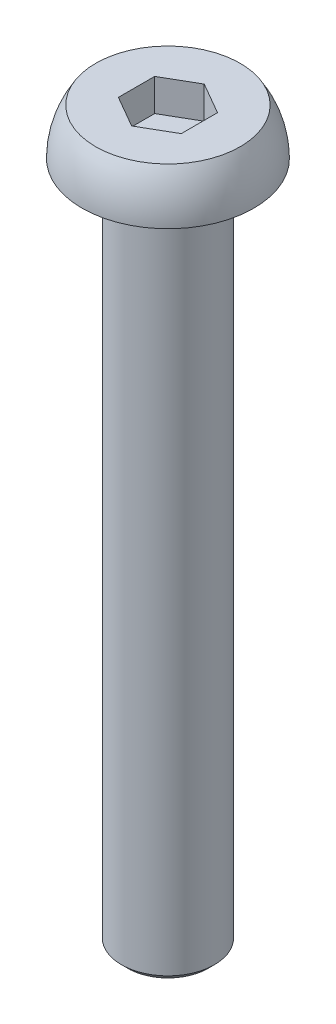
ISO-10303-21;
HEADER;
FILE_DESCRIPTION(('STEP AP214'),'2;1');
FILE_NAME('part.step','',(''),(''),'','','');
FILE_SCHEMA(('AUTOMOTIVE_DESIGN { 1 0 10303 214 1 1 1 1 }'));
ENDSEC;
DATA;
#1=APPLICATION_CONTEXT('core data for automotive mechanical design processes');
#2=APPLICATION_PROTOCOL_DEFINITION('international standard','automotive_design',2000,#1);
#3=PRODUCT_CONTEXT('',#1,'mechanical');
#4=PRODUCT('Part','Part','',(#3));
#5=PRODUCT_RELATED_PRODUCT_CATEGORY('part','',(#4));
#6=PRODUCT_DEFINITION_FORMATION('','',#4);
#7=PRODUCT_DEFINITION_CONTEXT('part definition',#1,'design');
#8=PRODUCT_DEFINITION('design','',#6,#7);
#9=PRODUCT_DEFINITION_SHAPE('','',#8);
#10=(LENGTH_UNIT() NAMED_UNIT(*) SI_UNIT(.MILLI.,.METRE.));
#11=(NAMED_UNIT(*) PLANE_ANGLE_UNIT() SI_UNIT($,.RADIAN.));
#12=(NAMED_UNIT(*) SI_UNIT($,.STERADIAN.) SOLID_ANGLE_UNIT());
#13=UNCERTAINTY_MEASURE_WITH_UNIT(LENGTH_MEASURE(1.E-05),#10,'distance_accuracy_value','');
#14=(GEOMETRIC_REPRESENTATION_CONTEXT(3) GLOBAL_UNCERTAINTY_ASSIGNED_CONTEXT((#13)) GLOBAL_UNIT_ASSIGNED_CONTEXT((#10,
#11,#12)) REPRESENTATION_CONTEXT('',''));
#15=CARTESIAN_POINT('',(0.,0.,0.));
#16=DIRECTION('',(0.,0.,1.));
#17=DIRECTION('',(1.,0.,0.));
#18=AXIS2_PLACEMENT_3D('',#15,#16,#17);
#19=CARTESIAN_POINT('',(-2.33465736244101,1.5,0.));
#20=DIRECTION('',(0.,1.,0.));
#21=DIRECTION('',(0.,0.,1.));
#22=AXIS2_PLACEMENT_3D('',#19,#20,#21);
#23=PLANE('',#22);
#24=DIRECTION('',(-0.866025403784439,0.,-0.5));
#25=VECTOR('',#24,1.);
#26=CARTESIAN_POINT('',(1.015,1.5,-0.58601052322747));
#27=LINE('',#26,#25);
#28=CARTESIAN_POINT('',(1.015,1.5,-0.58601052322747));
#29=VERTEX_POINT('',#28);
#30=CARTESIAN_POINT('',(0.,1.5,-1.17202104645494));
#31=VERTEX_POINT('',#30);
#32=EDGE_CURVE('E58',#29,#31,#27,.T.);
#33=ORIENTED_EDGE('',*,*,#32,.F.);
#34=DIRECTION('',(0.,0.,-1.));
#35=VECTOR('',#34,1.);
#36=CARTESIAN_POINT('',(1.015,1.5,0.58601052322747));
#37=LINE('',#36,#35);
#38=CARTESIAN_POINT('',(1.015,1.5,0.58601052322747));
#39=VERTEX_POINT('',#38);
#40=EDGE_CURVE('E151',#39,#29,#37,.T.);
#41=ORIENTED_EDGE('',*,*,#40,.F.);
#42=DIRECTION('',(0.866025403784439,0.,-0.5));
#43=VECTOR('',#42,1.);
#44=CARTESIAN_POINT('',(0.,1.5,1.17202104645494));
#45=LINE('',#44,#43);
#46=CARTESIAN_POINT('',(0.,1.5,1.17202104645494));
#47=VERTEX_POINT('',#46);
#48=EDGE_CURVE('E148',#47,#39,#45,.T.);
#49=ORIENTED_EDGE('',*,*,#48,.F.);
#50=DIRECTION('',(0.866025403784439,0.,0.5));
#51=VECTOR('',#50,1.);
#52=CARTESIAN_POINT('',(-1.015,1.5,0.58601052322747));
#53=LINE('',#52,#51);
#54=CARTESIAN_POINT('',(-1.015,1.5,0.58601052322747));
#55=VERTEX_POINT('',#54);
#56=EDGE_CURVE('E106',#55,#47,#53,.T.);
#57=ORIENTED_EDGE('',*,*,#56,.F.);
#58=DIRECTION('',(0.,0.,1.));
#59=VECTOR('',#58,1.);
#60=CARTESIAN_POINT('',(-1.015,1.5,-0.58601052322747));
#61=LINE('',#60,#59);
#62=CARTESIAN_POINT('',(-1.015,1.5,-0.58601052322747));
#63=VERTEX_POINT('',#62);
#64=EDGE_CURVE('E142',#63,#55,#61,.T.);
#65=ORIENTED_EDGE('',*,*,#64,.F.);
#66=DIRECTION('',(-0.866025403784439,0.,0.5));
#67=VECTOR('',#66,1.);
#68=CARTESIAN_POINT('',(0.,1.5,-1.17202104645494));
#69=LINE('',#68,#67);
#70=EDGE_CURVE('E138',#31,#63,#69,.T.);
#71=ORIENTED_EDGE('',*,*,#70,.F.);
#72=EDGE_LOOP('',(#33,#41,#49,#57,#65,#71));
#73=FACE_BOUND('',#72,.T.);
#74=CARTESIAN_POINT('',(0.,1.5,0.));
#75=DIRECTION('',(0.,1.,0.));
#76=DIRECTION('',(0.,0.,1.));
#77=AXIS2_PLACEMENT_3D('',#74,#75,#76);
#78=CIRCLE('',#77,2.33465736244101);
#79=CARTESIAN_POINT('',(0.,1.5,2.33465736244101));
#80=VERTEX_POINT('',#79);
#81=EDGE_CURVE('E171',#80,#80,#78,.T.);
#82=ORIENTED_EDGE('',*,*,#81,.T.);
#83=EDGE_LOOP('',(#82));
#84=FACE_BOUND('',#83,.T.);
#85=ADVANCED_FACE('F41',(#73,#84),#23,.T.);
#86=CARTESIAN_POINT('',(0.,0.,0.));
#87=DIRECTION('',(0.,1.,0.));
#88=DIRECTION('',(-1.,0.,0.));
#89=AXIS2_PLACEMENT_3D('',#86,#87,#88);
#90=SPHERICAL_SURFACE('',#89,2.775);
#91=CARTESIAN_POINT('',(0.,0.,0.));
#92=DIRECTION('',(0.,1.,0.));
#93=DIRECTION('',(0.,0.,1.));
#94=AXIS2_PLACEMENT_3D('',#91,#92,#93);
#95=CIRCLE('',#94,2.775);
#96=CARTESIAN_POINT('',(0.,0.,2.775));
#97=VERTEX_POINT('',#96);
#98=EDGE_CURVE('E157',#97,#97,#95,.T.);
#99=ORIENTED_EDGE('',*,*,#98,.T.);
#100=EDGE_LOOP('',(#99));
#101=FACE_BOUND('',#100,.T.);
#102=ORIENTED_EDGE('',*,*,#81,.F.);
#103=EDGE_LOOP('',(#102));
#104=FACE_BOUND('',#103,.T.);
#105=ADVANCED_FACE('F192',(#101,#104),#90,.T.);
#106=CARTESIAN_POINT('',(0.,0.,0.));
#107=DIRECTION('',(0.,-1.,0.));
#108=DIRECTION('',(0.,0.,-1.));
#109=AXIS2_PLACEMENT_3D('',#106,#107,#108);
#110=PLANE('',#109);
#111=CARTESIAN_POINT('',(0.,0.,0.));
#112=DIRECTION('',(0.,-1.,0.));
#113=DIRECTION('',(0.,0.,-1.));
#114=AXIS2_PLACEMENT_3D('',#111,#112,#113);
#115=CIRCLE('',#114,1.5);
#116=CARTESIAN_POINT('',(0.,0.,-1.5));
#117=VERTEX_POINT('',#116);
#118=EDGE_CURVE('E167',#117,#117,#115,.T.);
#119=ORIENTED_EDGE('',*,*,#118,.F.);
#120=EDGE_LOOP('',(#119));
#121=FACE_BOUND('',#120,.T.);
#122=ORIENTED_EDGE('',*,*,#98,.F.);
#123=EDGE_LOOP('',(#122));
#124=FACE_BOUND('',#123,.T.);
#125=ADVANCED_FACE('F197',(#121,#124),#110,.T.);
#126=CARTESIAN_POINT('',(0.,-22.,0.));
#127=DIRECTION('',(0.,1.,0.));
#128=DIRECTION('',(0.,0.,1.));
#129=AXIS2_PLACEMENT_3D('',#126,#127,#128);
#130=CYLINDRICAL_SURFACE('',#129,1.5);
#131=CARTESIAN_POINT('',(0.,-21.8,0.));
#132=DIRECTION('',(0.,-1.,0.));
#133=DIRECTION('',(0.,0.,-1.));
#134=AXIS2_PLACEMENT_3D('',#131,#132,#133);
#135=CIRCLE('',#134,1.5);
#136=CARTESIAN_POINT('',(0.,-21.8,-1.5));
#137=VERTEX_POINT('',#136);
#138=EDGE_CURVE('E11',#137,#137,#135,.F.);
#139=ORIENTED_EDGE('',*,*,#138,.T.);
#140=EDGE_LOOP('',(#139));
#141=FACE_BOUND('',#140,.T.);
#142=ORIENTED_EDGE('',*,*,#118,.T.);
#143=EDGE_LOOP('',(#142));
#144=FACE_BOUND('',#143,.T.);
#145=ADVANCED_FACE('F204',(#141,#144),#130,.T.);
#146=CARTESIAN_POINT('',(0.,-22.,0.));
#147=DIRECTION('',(0.,-1.,0.));
#148=DIRECTION('',(0.,0.,-1.));
#149=AXIS2_PLACEMENT_3D('',#146,#147,#148);
#150=PLANE('',#149);
#151=CARTESIAN_POINT('',(0.,-22.,0.));
#152=DIRECTION('',(0.,-1.,0.));
#153=DIRECTION('',(0.,0.,-1.));
#154=AXIS2_PLACEMENT_3D('',#151,#152,#153);
#155=CIRCLE('',#154,1.3);
#156=CARTESIAN_POINT('',(0.,-22.,-1.3));
#157=VERTEX_POINT('',#156);
#158=EDGE_CURVE('E51',#157,#157,#155,.T.);
#159=ORIENTED_EDGE('',*,*,#158,.T.);
#160=EDGE_LOOP('',(#159));
#161=FACE_BOUND('',#160,.T.);
#162=ADVANCED_FACE('F181',(#161),#150,.T.);
#163=CARTESIAN_POINT('',(1.015,0.459999999999999,-0.58601052322747));
#164=DIRECTION('',(0.5,0.,-0.866025403784439));
#165=DIRECTION('',(-0.866025403784439,0.,-0.5));
#166=AXIS2_PLACEMENT_3D('',#163,#164,#165);
#167=PLANE('',#166);
#168=ORIENTED_EDGE('',*,*,#32,.T.);
#169=DIRECTION('',(0.,1.,0.));
#170=VECTOR('',#169,1.);
#171=CARTESIAN_POINT('',(0.,0.459999999999999,-1.17202104645494));
#172=LINE('',#171,#170);
#173=CARTESIAN_POINT('',(0.,0.459999999999999,-1.17202104645494));
#174=VERTEX_POINT('',#173);
#175=EDGE_CURVE('E88',#174,#31,#172,.T.);
#176=ORIENTED_EDGE('',*,*,#175,.F.);
#177=DIRECTION('',(-0.866025403784439,0.,-0.5));
#178=VECTOR('',#177,1.);
#179=CARTESIAN_POINT('',(1.015,0.459999999999999,-0.58601052322747));
#180=LINE('',#179,#178);
#181=CARTESIAN_POINT('',(1.015,0.459999999999999,-0.58601052322747));
#182=VERTEX_POINT('',#181);
#183=EDGE_CURVE('E154',#182,#174,#180,.T.);
#184=ORIENTED_EDGE('',*,*,#183,.F.);
#185=DIRECTION('',(0.,1.,0.));
#186=VECTOR('',#185,1.);
#187=CARTESIAN_POINT('',(1.015,0.459999999999999,-0.58601052322747));
#188=LINE('',#187,#186);
#189=EDGE_CURVE('E66',#182,#29,#188,.T.);
#190=ORIENTED_EDGE('',*,*,#189,.T.);
#191=EDGE_LOOP('',(#168,#176,#184,#190));
#192=FACE_BOUND('',#191,.T.);
#193=ADVANCED_FACE('F211',(#192),#167,.F.);
#194=CARTESIAN_POINT('',(1.015,0.459999999999999,0.58601052322747));
#195=DIRECTION('',(1.,0.,0.));
#196=DIRECTION('',(0.,0.,-1.));
#197=AXIS2_PLACEMENT_3D('',#194,#195,#196);
#198=PLANE('',#197);
#199=ORIENTED_EDGE('',*,*,#40,.T.);
#200=ORIENTED_EDGE('',*,*,#189,.F.);
#201=DIRECTION('',(0.,0.,-1.));
#202=VECTOR('',#201,1.);
#203=CARTESIAN_POINT('',(1.015,0.459999999999999,0.58601052322747));
#204=LINE('',#203,#202);
#205=CARTESIAN_POINT('',(1.015,0.459999999999999,0.58601052322747));
#206=VERTEX_POINT('',#205);
#207=EDGE_CURVE('E120',#206,#182,#204,.T.);
#208=ORIENTED_EDGE('',*,*,#207,.F.);
#209=DIRECTION('',(0.,1.,0.));
#210=VECTOR('',#209,1.);
#211=CARTESIAN_POINT('',(1.015,0.459999999999999,0.58601052322747));
#212=LINE('',#211,#210);
#213=EDGE_CURVE('E111',#206,#39,#212,.T.);
#214=ORIENTED_EDGE('',*,*,#213,.T.);
#215=EDGE_LOOP('',(#199,#200,#208,#214));
#216=FACE_BOUND('',#215,.T.);
#217=ADVANCED_FACE('F214',(#216),#198,.F.);
#218=CARTESIAN_POINT('',(0.,0.459999999999999,1.17202104645494));
#219=DIRECTION('',(0.5,0.,0.866025403784439));
#220=DIRECTION('',(0.866025403784439,0.,-0.5));
#221=AXIS2_PLACEMENT_3D('',#218,#219,#220);
#222=PLANE('',#221);
#223=ORIENTED_EDGE('',*,*,#48,.T.);
#224=ORIENTED_EDGE('',*,*,#213,.F.);
#225=DIRECTION('',(0.866025403784439,0.,-0.5));
#226=VECTOR('',#225,1.);
#227=CARTESIAN_POINT('',(0.,0.459999999999999,1.17202104645494));
#228=LINE('',#227,#226);
#229=CARTESIAN_POINT('',(0.,0.459999999999999,1.17202104645494));
#230=VERTEX_POINT('',#229);
#231=EDGE_CURVE('E115',#230,#206,#228,.T.);
#232=ORIENTED_EDGE('',*,*,#231,.F.);
#233=DIRECTION('',(0.,1.,0.));
#234=VECTOR('',#233,1.);
#235=CARTESIAN_POINT('',(0.,0.459999999999999,1.17202104645494));
#236=LINE('',#235,#234);
#237=EDGE_CURVE('E99',#230,#47,#236,.T.);
#238=ORIENTED_EDGE('',*,*,#237,.T.);
#239=EDGE_LOOP('',(#223,#224,#232,#238));
#240=FACE_BOUND('',#239,.T.);
#241=ADVANCED_FACE('F116',(#240),#222,.F.);
#242=CARTESIAN_POINT('',(-1.015,0.459999999999999,0.58601052322747));
#243=DIRECTION('',(-0.5,0.,0.866025403784439));
#244=DIRECTION('',(0.866025403784439,0.,0.5));
#245=AXIS2_PLACEMENT_3D('',#242,#243,#244);
#246=PLANE('',#245);
#247=ORIENTED_EDGE('',*,*,#56,.T.);
#248=ORIENTED_EDGE('',*,*,#237,.F.);
#249=DIRECTION('',(0.866025403784439,0.,0.5));
#250=VECTOR('',#249,1.);
#251=CARTESIAN_POINT('',(-1.015,0.459999999999999,0.58601052322747));
#252=LINE('',#251,#250);
#253=CARTESIAN_POINT('',(-1.015,0.459999999999999,0.58601052322747));
#254=VERTEX_POINT('',#253);
#255=EDGE_CURVE('E103',#254,#230,#252,.T.);
#256=ORIENTED_EDGE('',*,*,#255,.F.);
#257=DIRECTION('',(0.,1.,0.));
#258=VECTOR('',#257,1.);
#259=CARTESIAN_POINT('',(-1.015,0.459999999999999,0.58601052322747));
#260=LINE('',#259,#258);
#261=EDGE_CURVE('E112',#254,#55,#260,.T.);
#262=ORIENTED_EDGE('',*,*,#261,.T.);
#263=EDGE_LOOP('',(#247,#248,#256,#262));
#264=FACE_BOUND('',#263,.T.);
#265=ADVANCED_FACE('F101',(#264),#246,.F.);
#266=CARTESIAN_POINT('',(-1.015,0.459999999999999,-0.58601052322747));
#267=DIRECTION('',(-1.,0.,0.));
#268=DIRECTION('',(0.,0.,1.));
#269=AXIS2_PLACEMENT_3D('',#266,#267,#268);
#270=PLANE('',#269);
#271=ORIENTED_EDGE('',*,*,#64,.T.);
#272=ORIENTED_EDGE('',*,*,#261,.F.);
#273=DIRECTION('',(0.,0.,1.));
#274=VECTOR('',#273,1.);
#275=CARTESIAN_POINT('',(-1.015,0.459999999999999,-0.58601052322747));
#276=LINE('',#275,#274);
#277=CARTESIAN_POINT('',(-1.015,0.459999999999999,-0.58601052322747));
#278=VERTEX_POINT('',#277);
#279=EDGE_CURVE('E126',#278,#254,#276,.T.);
#280=ORIENTED_EDGE('',*,*,#279,.F.);
#281=DIRECTION('',(0.,1.,0.));
#282=VECTOR('',#281,1.);
#283=CARTESIAN_POINT('',(-1.015,0.459999999999999,-0.58601052322747));
#284=LINE('',#283,#282);
#285=EDGE_CURVE('E162',#278,#63,#284,.T.);
#286=ORIENTED_EDGE('',*,*,#285,.T.);
#287=EDGE_LOOP('',(#271,#272,#280,#286));
#288=FACE_BOUND('',#287,.T.);
#289=ADVANCED_FACE('F217',(#288),#270,.F.);
#290=CARTESIAN_POINT('',(0.,0.459999999999999,-1.17202104645494));
#291=DIRECTION('',(-0.5,0.,-0.866025403784439));
#292=DIRECTION('',(-0.866025403784439,0.,0.5));
#293=AXIS2_PLACEMENT_3D('',#290,#291,#292);
#294=PLANE('',#293);
#295=ORIENTED_EDGE('',*,*,#70,.T.);
#296=ORIENTED_EDGE('',*,*,#285,.F.);
#297=DIRECTION('',(-0.866025403784439,0.,0.5));
#298=VECTOR('',#297,1.);
#299=CARTESIAN_POINT('',(0.,0.459999999999999,-1.17202104645494));
#300=LINE('',#299,#298);
#301=EDGE_CURVE('E130',#174,#278,#300,.T.);
#302=ORIENTED_EDGE('',*,*,#301,.F.);
#303=ORIENTED_EDGE('',*,*,#175,.T.);
#304=EDGE_LOOP('',(#295,#296,#302,#303));
#305=FACE_BOUND('',#304,.T.);
#306=ADVANCED_FACE('F188',(#305),#294,.F.);
#307=CARTESIAN_POINT('',(0.,0.459999999999999,0.));
#308=DIRECTION('',(0.,1.,0.));
#309=DIRECTION('',(0.,0.,1.));
#310=AXIS2_PLACEMENT_3D('',#307,#308,#309);
#311=PLANE('',#310);
#312=ORIENTED_EDGE('',*,*,#183,.T.);
#313=ORIENTED_EDGE('',*,*,#301,.T.);
#314=ORIENTED_EDGE('',*,*,#279,.T.);
#315=ORIENTED_EDGE('',*,*,#255,.T.);
#316=ORIENTED_EDGE('',*,*,#231,.T.);
#317=ORIENTED_EDGE('',*,*,#207,.T.);
#318=EDGE_LOOP('',(#312,#313,#314,#315,#316,#317));
#319=FACE_BOUND('',#318,.T.);
#320=ADVANCED_FACE('F123',(#319),#311,.T.);
#321=CARTESIAN_POINT('',(0.,-22.,0.));
#322=DIRECTION('',(0.,1.,0.));
#323=DIRECTION('',(0.,0.,1.));
#324=AXIS2_PLACEMENT_3D('',#321,#322,#323);
#325=CONICAL_SURFACE('',#324,1.3,0.785398163397446);
#326=ORIENTED_EDGE('',*,*,#138,.F.);
#327=EDGE_LOOP('',(#326));
#328=FACE_BOUND('',#327,.T.);
#329=ORIENTED_EDGE('',*,*,#158,.F.);
#330=EDGE_LOOP('',(#329));
#331=FACE_BOUND('',#330,.T.);
#332=ADVANCED_FACE('F44',(#328,#331),#325,.T.);
#333=CLOSED_SHELL('',(#85,#105,#125,#145,#162,#193,#217,#241,#265,#289,#306,#320,#332));
#334=MANIFOLD_SOLID_BREP('B2',#333);
#335=ADVANCED_BREP_SHAPE_REPRESENTATION('',(#18,#334),#14);
#336=SHAPE_DEFINITION_REPRESENTATION(#9,#335);
ENDSEC;
END-ISO-10303-21;
